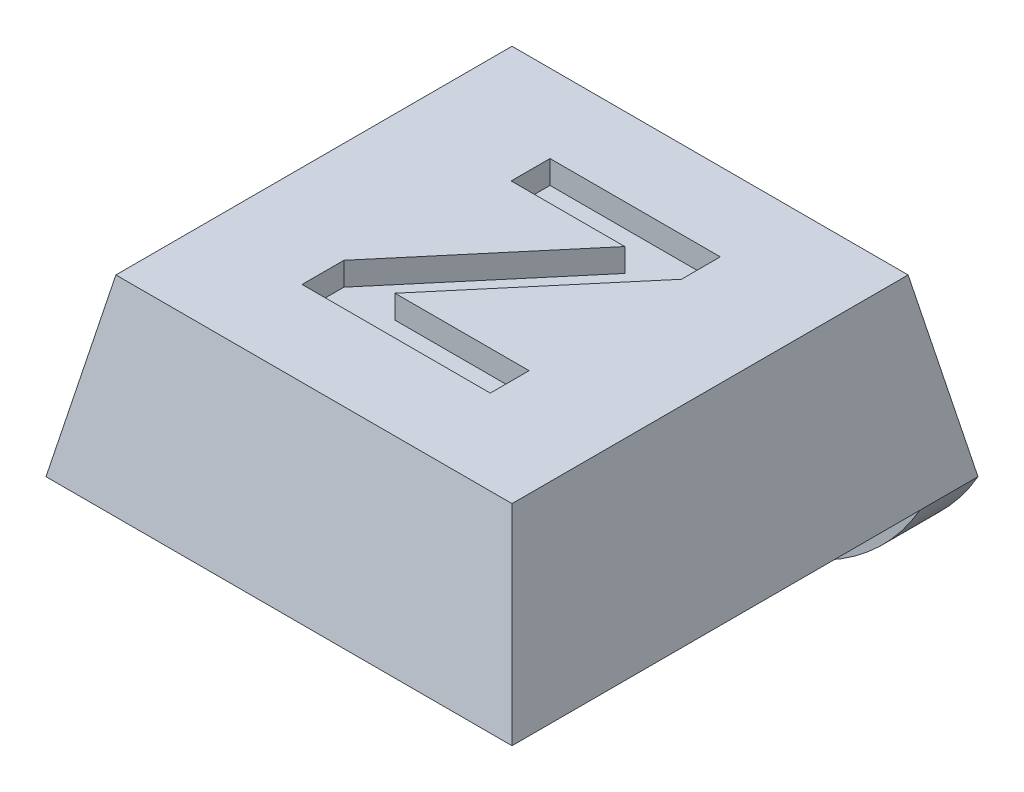
ISO-10303-21;
HEADER;
FILE_DESCRIPTION(('STEP AP214'),'2;1');
FILE_NAME('part.step','',(''),(''),'','','');
FILE_SCHEMA(('AUTOMOTIVE_DESIGN { 1 0 10303 214 1 1 1 1 }'));
ENDSEC;
DATA;
#1=APPLICATION_CONTEXT('core data for automotive mechanical design processes');
#2=APPLICATION_PROTOCOL_DEFINITION('international standard','automotive_design',2000,#1);
#3=PRODUCT_CONTEXT('',#1,'mechanical');
#4=PRODUCT('Part','Part','',(#3));
#5=PRODUCT_RELATED_PRODUCT_CATEGORY('part','',(#4));
#6=PRODUCT_DEFINITION_FORMATION('','',#4);
#7=PRODUCT_DEFINITION_CONTEXT('part definition',#1,'design');
#8=PRODUCT_DEFINITION('design','',#6,#7);
#9=PRODUCT_DEFINITION_SHAPE('','',#8);
#10=(LENGTH_UNIT() NAMED_UNIT(*) SI_UNIT(.MILLI.,.METRE.));
#11=(NAMED_UNIT(*) PLANE_ANGLE_UNIT() SI_UNIT($,.RADIAN.));
#12=(NAMED_UNIT(*) SI_UNIT($,.STERADIAN.) SOLID_ANGLE_UNIT());
#13=UNCERTAINTY_MEASURE_WITH_UNIT(LENGTH_MEASURE(1.E-05),#10,'distance_accuracy_value','');
#14=(GEOMETRIC_REPRESENTATION_CONTEXT(3) GLOBAL_UNCERTAINTY_ASSIGNED_CONTEXT((#13)) GLOBAL_UNIT_ASSIGNED_CONTEXT((#10,
#11,#12)) REPRESENTATION_CONTEXT('',''));
#15=CARTESIAN_POINT('',(0.,0.,0.));
#16=DIRECTION('',(0.,0.,1.));
#17=DIRECTION('',(1.,0.,0.));
#18=AXIS2_PLACEMENT_3D('',#15,#16,#17);
#19=CARTESIAN_POINT('',(0.,3.,0.));
#20=DIRECTION('',(0.,-1.,0.));
#21=DIRECTION('',(0.,0.,-1.));
#22=AXIS2_PLACEMENT_3D('',#19,#20,#21);
#23=PLANE('',#22);
#24=DIRECTION('',(-1.,0.,0.));
#25=VECTOR('',#24,1.);
#26=CARTESIAN_POINT('',(11.,3.,-0.6));
#27=LINE('',#26,#25);
#28=CARTESIAN_POINT('',(7.4,3.,-0.6));
#29=VERTEX_POINT('',#28);
#30=CARTESIAN_POINT('',(0.6,3.,-0.6));
#31=VERTEX_POINT('',#30);
#32=EDGE_CURVE('E217',#29,#31,#27,.T.);
#33=ORIENTED_EDGE('',*,*,#32,.F.);
#34=DIRECTION('',(0.,0.,1.));
#35=VECTOR('',#34,1.);
#36=CARTESIAN_POINT('',(7.4,3.,-8.));
#37=LINE('',#36,#35);
#38=CARTESIAN_POINT('',(7.4,3.,-7.4));
#39=VERTEX_POINT('',#38);
#40=EDGE_CURVE('E230',#39,#29,#37,.T.);
#41=ORIENTED_EDGE('',*,*,#40,.F.);
#42=DIRECTION('',(-1.,0.,0.));
#43=VECTOR('',#42,1.);
#44=CARTESIAN_POINT('',(11.,3.,-7.4));
#45=LINE('',#44,#43);
#46=CARTESIAN_POINT('',(0.599999999999999,3.,-7.4));
#47=VERTEX_POINT('',#46);
#48=EDGE_CURVE('E213',#39,#47,#45,.T.);
#49=ORIENTED_EDGE('',*,*,#48,.T.);
#50=DIRECTION('',(0.,0.,1.));
#51=VECTOR('',#50,1.);
#52=CARTESIAN_POINT('',(0.6,3.,-8.));
#53=LINE('',#52,#51);
#54=EDGE_CURVE('E233',#47,#31,#53,.T.);
#55=ORIENTED_EDGE('',*,*,#54,.T.);
#56=EDGE_LOOP('',(#33,#41,#49,#55));
#57=FACE_BOUND('',#56,.T.);
#58=DIRECTION('',(-1.,0.,0.));
#59=VECTOR('',#58,1.);
#60=CARTESIAN_POINT('',(5.57023744052671,3.,-2.05683246367483));
#61=LINE('',#60,#59);
#62=CARTESIAN_POINT('',(5.57023744052671,3.,-2.05683246367483));
#63=VERTEX_POINT('',#62);
#64=CARTESIAN_POINT('',(2.33946820975748,3.,-2.05683246367483));
#65=VERTEX_POINT('',#64);
#66=EDGE_CURVE('E58',#63,#65,#61,.T.);
#67=ORIENTED_EDGE('',*,*,#66,.T.);
#68=DIRECTION('',(0.,0.,-1.));
#69=VECTOR('',#68,1.);
#70=CARTESIAN_POINT('',(2.33946820975748,3.,-2.05683246367483));
#71=LINE('',#70,#69);
#72=CARTESIAN_POINT('',(2.33946820975748,3.,-2.77478118162354));
#73=VERTEX_POINT('',#72);
#74=EDGE_CURVE('E185',#65,#73,#71,.T.);
#75=ORIENTED_EDGE('',*,*,#74,.T.);
#76=DIRECTION('',(0.644870939209783,0.,-0.764291483507891));
#77=VECTOR('',#76,1.);
#78=CARTESIAN_POINT('',(2.33946820975748,3.,-2.77478118162354));
#79=LINE('',#78,#77);
#80=CARTESIAN_POINT('',(4.54619897898825,3.,-5.39016579700816));
#81=VERTEX_POINT('',#80);
#82=EDGE_CURVE('E624',#73,#81,#79,.T.);
#83=ORIENTED_EDGE('',*,*,#82,.T.);
#84=DIRECTION('',(-1.,0.,0.));
#85=VECTOR('',#84,1.);
#86=CARTESIAN_POINT('',(4.54619897898825,3.,-5.39016579700816));
#87=LINE('',#86,#85);
#88=CARTESIAN_POINT('',(2.59587846616773,3.,-5.39016579700816));
#89=VERTEX_POINT('',#88);
#90=EDGE_CURVE('E626',#81,#89,#87,.T.);
#91=ORIENTED_EDGE('',*,*,#90,.T.);
#92=DIRECTION('',(0.,0.,-1.));
#93=VECTOR('',#92,1.);
#94=CARTESIAN_POINT('',(2.59587846616773,3.,-5.39016579700816));
#95=LINE('',#94,#93);
#96=CARTESIAN_POINT('',(2.59587846616773,3.,-6.05683246367483));
#97=VERTEX_POINT('',#96);
#98=EDGE_CURVE('E631',#89,#97,#95,.T.);
#99=ORIENTED_EDGE('',*,*,#98,.T.);
#100=DIRECTION('',(1.,0.,0.));
#101=VECTOR('',#100,1.);
#102=CARTESIAN_POINT('',(2.59587846616773,3.,-6.05683246367483));
#103=LINE('',#102,#101);
#104=CARTESIAN_POINT('',(5.51895538924466,3.,-6.05683246367483));
#105=VERTEX_POINT('',#104);
#106=EDGE_CURVE('E641',#97,#105,#103,.T.);
#107=ORIENTED_EDGE('',*,*,#106,.T.);
#108=DIRECTION('',(0.,0.,1.));
#109=VECTOR('',#108,1.);
#110=CARTESIAN_POINT('',(5.51895538924466,3.,-6.05683246367483));
#111=LINE('',#110,#109);
#112=CARTESIAN_POINT('',(5.51895538924466,3.,-5.39016579700816));
#113=VERTEX_POINT('',#112);
#114=EDGE_CURVE('E596',#105,#113,#111,.T.);
#115=ORIENTED_EDGE('',*,*,#114,.T.);
#116=DIRECTION('',(-0.645005060359543,0.,0.76417829863886));
#117=VECTOR('',#116,1.);
#118=CARTESIAN_POINT('',(5.51895538924466,3.,-5.39016579700816));
#119=LINE('',#118,#117);
#120=CARTESIAN_POINT('',(3.26815410719337,3.,-2.72349913034149));
#121=VERTEX_POINT('',#120);
#122=EDGE_CURVE('E591',#113,#121,#119,.T.);
#123=ORIENTED_EDGE('',*,*,#122,.T.);
#124=DIRECTION('',(1.,0.,0.));
#125=VECTOR('',#124,1.);
#126=CARTESIAN_POINT('',(3.26815410719337,3.,-2.72349913034149));
#127=LINE('',#126,#125);
#128=CARTESIAN_POINT('',(5.57023744052671,3.,-2.72349913034149));
#129=VERTEX_POINT('',#128);
#130=EDGE_CURVE('E585',#121,#129,#127,.T.);
#131=ORIENTED_EDGE('',*,*,#130,.T.);
#132=DIRECTION('',(0.,0.,1.));
#133=VECTOR('',#132,1.);
#134=CARTESIAN_POINT('',(5.57023744052671,3.,-2.72349913034149));
#135=LINE('',#134,#133);
#136=EDGE_CURVE('E181',#129,#63,#135,.T.);
#137=ORIENTED_EDGE('',*,*,#136,.T.);
#138=EDGE_LOOP('',(#67,#75,#83,#91,#99,#107,#115,#123,#131,#137));
#139=FACE_BOUND('',#138,.T.);
#140=ADVANCED_FACE('F42',(#57,#139),#23,.F.);
#141=CARTESIAN_POINT('',(8.,0.,-8.));
#142=DIRECTION('',(-0.98058067569092,-0.196116135138184,0.));
#143=DIRECTION('',(0.196116135138184,-0.98058067569092,0.));
#144=AXIS2_PLACEMENT_3D('',#141,#142,#143);
#145=PLANE('',#144);
#146=DIRECTION('',(-0.192450089729875,0.962250448649376,-0.192450089729875));
#147=VECTOR('',#146,1.);
#148=CARTESIAN_POINT('',(7.7037037037037,1.48148148148148,-0.296296296296296));
#149=LINE('',#148,#147);
#150=CARTESIAN_POINT('',(8.,0.,0.));
#151=VERTEX_POINT('',#150);
#152=EDGE_CURVE('E227',#151,#29,#149,.T.);
#153=ORIENTED_EDGE('',*,*,#152,.F.);
#154=DIRECTION('',(0.,0.,-1.));
#155=VECTOR('',#154,1.);
#156=CARTESIAN_POINT('',(8.,0.,0.));
#157=LINE('',#156,#155);
#158=CARTESIAN_POINT('',(8.,0.,-7.));
#159=VERTEX_POINT('',#158);
#160=EDGE_CURVE('E246',#151,#159,#157,.T.);
#161=ORIENTED_EDGE('',*,*,#160,.T.);
#162=DIRECTION('',(0.,0.,1.));
#163=VECTOR('',#162,1.);
#164=CARTESIAN_POINT('',(8.,0.,-8.));
#165=LINE('',#164,#163);
#166=CARTESIAN_POINT('',(8.,0.,-8.));
#167=VERTEX_POINT('',#166);
#168=EDGE_CURVE('E187',#167,#159,#165,.T.);
#169=ORIENTED_EDGE('',*,*,#168,.F.);
#170=DIRECTION('',(0.192450089729875,-0.962250448649376,-0.192450089729875));
#171=VECTOR('',#170,1.);
#172=CARTESIAN_POINT('',(8.,0.,-8.));
#173=LINE('',#172,#171);
#174=EDGE_CURVE('E220',#39,#167,#173,.T.);
#175=ORIENTED_EDGE('',*,*,#174,.F.);
#176=ORIENTED_EDGE('',*,*,#40,.T.);
#177=EDGE_LOOP('',(#153,#161,#169,#175,#176));
#178=FACE_BOUND('',#177,.T.);
#179=ADVANCED_FACE('F314',(#178),#145,.F.);
#180=CARTESIAN_POINT('',(0.,0.,-8.));
#181=DIRECTION('',(0.98058067569092,-0.196116135138184,0.));
#182=DIRECTION('',(0.196116135138184,0.98058067569092,0.));
#183=AXIS2_PLACEMENT_3D('',#180,#181,#182);
#184=PLANE('',#183);
#185=DIRECTION('',(-0.192450089729875,-0.962250448649376,0.192450089729875));
#186=VECTOR('',#185,1.);
#187=CARTESIAN_POINT('',(0.296296296296296,1.48148148148148,-0.296296296296296));
#188=LINE('',#187,#186);
#189=CARTESIAN_POINT('',(0.,0.,0.));
#190=VERTEX_POINT('',#189);
#191=EDGE_CURVE('E274',#31,#190,#188,.T.);
#192=ORIENTED_EDGE('',*,*,#191,.F.);
#193=ORIENTED_EDGE('',*,*,#54,.F.);
#194=DIRECTION('',(0.192450089729875,0.962250448649376,0.192450089729875));
#195=VECTOR('',#194,1.);
#196=CARTESIAN_POINT('',(0.,0.,-8.));
#197=LINE('',#196,#195);
#198=CARTESIAN_POINT('',(0.,0.,-8.));
#199=VERTEX_POINT('',#198);
#200=EDGE_CURVE('E245',#199,#47,#197,.T.);
#201=ORIENTED_EDGE('',*,*,#200,.F.);
#202=DIRECTION('',(0.,0.,1.));
#203=VECTOR('',#202,1.);
#204=CARTESIAN_POINT('',(0.,0.,0.));
#205=LINE('',#204,#203);
#206=CARTESIAN_POINT('',(0.,0.,-7.));
#207=VERTEX_POINT('',#206);
#208=EDGE_CURVE('E250',#199,#207,#205,.T.);
#209=ORIENTED_EDGE('',*,*,#208,.T.);
#210=EDGE_CURVE('E237',#207,#190,#205,.T.);
#211=ORIENTED_EDGE('',*,*,#210,.T.);
#212=EDGE_LOOP('',(#192,#193,#201,#209,#211));
#213=FACE_BOUND('',#212,.T.);
#214=ADVANCED_FACE('F298',(#213),#184,.F.);
#215=CARTESIAN_POINT('',(0.,0.,0.));
#216=DIRECTION('',(0.,-1.,0.));
#217=DIRECTION('',(0.,0.,-1.));
#218=AXIS2_PLACEMENT_3D('',#215,#216,#217);
#219=PLANE('',#218);
#220=DIRECTION('',(-1.,0.,0.));
#221=VECTOR('',#220,1.);
#222=CARTESIAN_POINT('',(0.,0.,-7.));
#223=LINE('',#222,#221);
#224=EDGE_CURVE('E193',#159,#207,#223,.T.);
#225=ORIENTED_EDGE('',*,*,#224,.F.);
#226=ORIENTED_EDGE('',*,*,#160,.F.);
#227=DIRECTION('',(1.,0.,0.));
#228=VECTOR('',#227,1.);
#229=CARTESIAN_POINT('',(0.,0.,0.));
#230=LINE('',#229,#228);
#231=EDGE_CURVE('E247',#190,#151,#230,.T.);
#232=ORIENTED_EDGE('',*,*,#231,.F.);
#233=ORIENTED_EDGE('',*,*,#210,.F.);
#234=EDGE_LOOP('',(#225,#226,#232,#233));
#235=FACE_BOUND('',#234,.T.);
#236=CARTESIAN_POINT('',(4.,0.,-3.75));
#237=DIRECTION('',(0.,-1.,0.));
#238=DIRECTION('',(0.,0.,-1.));
#239=AXIS2_PLACEMENT_3D('',#236,#237,#238);
#240=CIRCLE('',#239,1.8);
#241=CARTESIAN_POINT('',(4.,0.,-5.55));
#242=VERTEX_POINT('',#241);
#243=EDGE_CURVE('E205',#242,#242,#240,.T.);
#244=ORIENTED_EDGE('',*,*,#243,.F.);
#245=EDGE_LOOP('',(#244));
#246=FACE_BOUND('',#245,.T.);
#247=ADVANCED_FACE('F309',(#235,#246),#219,.T.);
#248=CARTESIAN_POINT('',(11.,3.,-7.4));
#249=DIRECTION('',(0.,0.196116135138184,-0.98058067569092));
#250=DIRECTION('',(0.,0.98058067569092,0.196116135138184));
#251=AXIS2_PLACEMENT_3D('',#248,#249,#250);
#252=PLANE('',#251);
#253=ORIENTED_EDGE('',*,*,#174,.T.);
#254=DIRECTION('',(-1.,0.,0.));
#255=VECTOR('',#254,1.);
#256=CARTESIAN_POINT('',(0.,0.,-8.));
#257=LINE('',#256,#255);
#258=EDGE_CURVE('E241',#167,#199,#257,.T.);
#259=ORIENTED_EDGE('',*,*,#258,.T.);
#260=ORIENTED_EDGE('',*,*,#200,.T.);
#261=ORIENTED_EDGE('',*,*,#48,.F.);
#262=EDGE_LOOP('',(#253,#259,#260,#261));
#263=FACE_BOUND('',#262,.T.);
#264=ADVANCED_FACE('F293',(#263),#252,.T.);
#265=CARTESIAN_POINT('',(11.,0.,0.));
#266=DIRECTION('',(0.,0.196116135138184,0.98058067569092));
#267=DIRECTION('',(0.,-0.98058067569092,0.196116135138184));
#268=AXIS2_PLACEMENT_3D('',#265,#266,#267);
#269=PLANE('',#268);
#270=ORIENTED_EDGE('',*,*,#152,.T.);
#271=ORIENTED_EDGE('',*,*,#32,.T.);
#272=ORIENTED_EDGE('',*,*,#191,.T.);
#273=ORIENTED_EDGE('',*,*,#231,.T.);
#274=EDGE_LOOP('',(#270,#271,#272,#273));
#275=FACE_BOUND('',#274,.T.);
#276=ADVANCED_FACE('F340',(#275),#269,.T.);
#277=CARTESIAN_POINT('',(4.,0.8,-3.75));
#278=DIRECTION('',(0.,-1.,0.));
#279=DIRECTION('',(0.,0.,-1.));
#280=AXIS2_PLACEMENT_3D('',#277,#278,#279);
#281=CYLINDRICAL_SURFACE('',#280,1.8);
#282=CARTESIAN_POINT('',(4.,0.8,-3.75));
#283=DIRECTION('',(0.,-1.,0.));
#284=DIRECTION('',(0.,0.,-1.));
#285=AXIS2_PLACEMENT_3D('',#282,#283,#284);
#286=CIRCLE('',#285,1.8);
#287=CARTESIAN_POINT('',(4.,0.8,-5.55));
#288=VERTEX_POINT('',#287);
#289=EDGE_CURVE('E209',#288,#288,#286,.T.);
#290=ORIENTED_EDGE('',*,*,#289,.F.);
#291=EDGE_LOOP('',(#290));
#292=FACE_BOUND('',#291,.T.);
#293=ORIENTED_EDGE('',*,*,#243,.T.);
#294=EDGE_LOOP('',(#293));
#295=FACE_BOUND('',#294,.T.);
#296=ADVANCED_FACE('F347',(#292,#295),#281,.F.);
#297=CARTESIAN_POINT('',(4.,0.8,-3.75));
#298=DIRECTION('',(0.,-1.,0.));
#299=DIRECTION('',(0.,0.,-1.));
#300=AXIS2_PLACEMENT_3D('',#297,#298,#299);
#301=PLANE('',#300);
#302=ORIENTED_EDGE('',*,*,#289,.T.);
#303=EDGE_LOOP('',(#302));
#304=FACE_BOUND('',#303,.T.);
#305=ADVANCED_FACE('F351',(#304),#301,.T.);
#306=CARTESIAN_POINT('',(0.,-2.,-8.));
#307=DIRECTION('',(0.,0.,1.));
#308=DIRECTION('',(1.,0.,0.));
#309=AXIS2_PLACEMENT_3D('',#306,#307,#308);
#310=PLANE('',#309);
#311=ORIENTED_EDGE('',*,*,#258,.F.);
#312=CARTESIAN_POINT('',(4.53589838486225,2.,-8.));
#313=DIRECTION('',(0.,0.,1.));
#314=DIRECTION('',(1.,0.,0.));
#315=AXIS2_PLACEMENT_3D('',#312,#313,#314);
#316=CIRCLE('',#315,4.);
#317=CARTESIAN_POINT('',(4.53589838486225,-2.,-8.));
#318=VERTEX_POINT('',#317);
#319=EDGE_CURVE('E11',#167,#318,#316,.F.);
#320=ORIENTED_EDGE('',*,*,#319,.T.);
#321=DIRECTION('',(1.,0.,0.));
#322=VECTOR('',#321,1.);
#323=CARTESIAN_POINT('',(0.,-2.,-8.));
#324=LINE('',#323,#322);
#325=CARTESIAN_POINT('',(3.46410161513775,-2.,-8.));
#326=VERTEX_POINT('',#325);
#327=EDGE_CURVE('E199',#326,#318,#324,.T.);
#328=ORIENTED_EDGE('',*,*,#327,.F.);
#329=CARTESIAN_POINT('',(3.46410161513775,2.,-8.));
#330=DIRECTION('',(0.,0.,1.));
#331=DIRECTION('',(1.,0.,0.));
#332=AXIS2_PLACEMENT_3D('',#329,#330,#331);
#333=CIRCLE('',#332,4.);
#334=EDGE_CURVE('E51',#326,#199,#333,.F.);
#335=ORIENTED_EDGE('',*,*,#334,.T.);
#336=EDGE_LOOP('',(#311,#320,#328,#335));
#337=FACE_BOUND('',#336,.T.);
#338=ADVANCED_FACE('F286',(#337),#310,.F.);
#339=CARTESIAN_POINT('',(0.,-2.,-7.));
#340=DIRECTION('',(0.,0.,-1.));
#341=DIRECTION('',(-1.,0.,0.));
#342=AXIS2_PLACEMENT_3D('',#339,#340,#341);
#343=PLANE('',#342);
#344=DIRECTION('',(-1.,0.,0.));
#345=VECTOR('',#344,1.);
#346=CARTESIAN_POINT('',(0.,-2.,-7.));
#347=LINE('',#346,#345);
#348=CARTESIAN_POINT('',(4.53589838486225,-2.,-7.));
#349=VERTEX_POINT('',#348);
#350=CARTESIAN_POINT('',(3.46410161513775,-2.,-7.));
#351=VERTEX_POINT('',#350);
#352=EDGE_CURVE('E203',#349,#351,#347,.T.);
#353=ORIENTED_EDGE('',*,*,#352,.F.);
#354=CARTESIAN_POINT('',(4.53589838486225,2.,-7.));
#355=DIRECTION('',(0.,0.,-1.));
#356=DIRECTION('',(-1.,0.,0.));
#357=AXIS2_PLACEMENT_3D('',#354,#355,#356);
#358=CIRCLE('',#357,4.);
#359=EDGE_CURVE('E280',#349,#159,#358,.F.);
#360=ORIENTED_EDGE('',*,*,#359,.T.);
#361=ORIENTED_EDGE('',*,*,#224,.T.);
#362=CARTESIAN_POINT('',(3.46410161513775,2.,-7.));
#363=DIRECTION('',(0.,0.,-1.));
#364=DIRECTION('',(-1.,0.,0.));
#365=AXIS2_PLACEMENT_3D('',#362,#363,#364);
#366=CIRCLE('',#365,4.);
#367=EDGE_CURVE('E66',#207,#351,#366,.F.);
#368=ORIENTED_EDGE('',*,*,#367,.T.);
#369=EDGE_LOOP('',(#353,#360,#361,#368));
#370=FACE_BOUND('',#369,.T.);
#371=ADVANCED_FACE('F304',(#370),#343,.F.);
#372=CARTESIAN_POINT('',(0.,-2.,0.));
#373=DIRECTION('',(0.,1.,0.));
#374=DIRECTION('',(0.,0.,1.));
#375=AXIS2_PLACEMENT_3D('',#372,#373,#374);
#376=PLANE('',#375);
#377=ORIENTED_EDGE('',*,*,#327,.T.);
#378=DIRECTION('',(0.,0.,1.));
#379=VECTOR('',#378,1.);
#380=CARTESIAN_POINT('',(4.53589838486225,-2.,0.));
#381=LINE('',#380,#379);
#382=EDGE_CURVE('E273',#318,#349,#381,.T.);
#383=ORIENTED_EDGE('',*,*,#382,.T.);
#384=ORIENTED_EDGE('',*,*,#352,.T.);
#385=DIRECTION('',(0.,0.,-1.));
#386=VECTOR('',#385,1.);
#387=CARTESIAN_POINT('',(3.46410161513775,-2.,0.));
#388=LINE('',#387,#386);
#389=EDGE_CURVE('E269',#351,#326,#388,.T.);
#390=ORIENTED_EDGE('',*,*,#389,.T.);
#391=EDGE_LOOP('',(#377,#383,#384,#390));
#392=FACE_BOUND('',#391,.T.);
#393=ADVANCED_FACE('F302',(#392),#376,.F.);
#394=CARTESIAN_POINT('',(4.53589838486225,2.,-8.));
#395=DIRECTION('',(0.,0.,1.));
#396=DIRECTION('',(1.,0.,0.));
#397=AXIS2_PLACEMENT_3D('',#394,#395,#396);
#398=CYLINDRICAL_SURFACE('',#397,4.);
#399=ORIENTED_EDGE('',*,*,#319,.F.);
#400=ORIENTED_EDGE('',*,*,#168,.T.);
#401=ORIENTED_EDGE('',*,*,#359,.F.);
#402=ORIENTED_EDGE('',*,*,#382,.F.);
#403=EDGE_LOOP('',(#399,#400,#401,#402));
#404=FACE_BOUND('',#403,.T.);
#405=ADVANCED_FACE('F315',(#404),#398,.T.);
#406=CARTESIAN_POINT('',(3.46410161513775,2.,-8.));
#407=DIRECTION('',(0.,0.,-1.));
#408=DIRECTION('',(-1.,0.,0.));
#409=AXIS2_PLACEMENT_3D('',#406,#407,#408);
#410=CYLINDRICAL_SURFACE('',#409,4.);
#411=ORIENTED_EDGE('',*,*,#367,.F.);
#412=ORIENTED_EDGE('',*,*,#208,.F.);
#413=ORIENTED_EDGE('',*,*,#334,.F.);
#414=ORIENTED_EDGE('',*,*,#389,.F.);
#415=EDGE_LOOP('',(#411,#412,#413,#414));
#416=FACE_BOUND('',#415,.T.);
#417=ADVANCED_FACE('F44',(#416),#410,.T.);
#418=CARTESIAN_POINT('',(5.57023744052671,2.6,-2.05683246367483));
#419=DIRECTION('',(0.,0.,-1.));
#420=DIRECTION('',(-1.,0.,0.));
#421=AXIS2_PLACEMENT_3D('',#418,#419,#420);
#422=PLANE('',#421);
#423=ORIENTED_EDGE('',*,*,#66,.F.);
#424=DIRECTION('',(0.,1.,0.));
#425=VECTOR('',#424,1.);
#426=CARTESIAN_POINT('',(5.57023744052671,2.6,-2.05683246367483));
#427=LINE('',#426,#425);
#428=CARTESIAN_POINT('',(5.57023744052671,2.6,-2.05683246367483));
#429=VERTEX_POINT('',#428);
#430=EDGE_CURVE('E179',#429,#63,#427,.T.);
#431=ORIENTED_EDGE('',*,*,#430,.F.);
#432=DIRECTION('',(-1.,0.,0.));
#433=VECTOR('',#432,1.);
#434=CARTESIAN_POINT('',(5.57023744052671,2.6,-2.05683246367483));
#435=LINE('',#434,#433);
#436=CARTESIAN_POINT('',(2.33946820975748,2.6,-2.05683246367483));
#437=VERTEX_POINT('',#436);
#438=EDGE_CURVE('E169',#429,#437,#435,.T.);
#439=ORIENTED_EDGE('',*,*,#438,.T.);
#440=DIRECTION('',(0.,1.,0.));
#441=VECTOR('',#440,1.);
#442=CARTESIAN_POINT('',(2.33946820975748,2.6,-2.05683246367483));
#443=LINE('',#442,#441);
#444=EDGE_CURVE('E178',#437,#65,#443,.T.);
#445=ORIENTED_EDGE('',*,*,#444,.T.);
#446=EDGE_LOOP('',(#423,#431,#439,#445));
#447=FACE_BOUND('',#446,.T.);
#448=ADVANCED_FACE('F177',(#447),#422,.T.);
#449=CARTESIAN_POINT('',(2.33946820975748,2.6,-2.05683246367483));
#450=DIRECTION('',(1.,0.,0.));
#451=DIRECTION('',(0.,0.,-1.));
#452=AXIS2_PLACEMENT_3D('',#449,#450,#451);
#453=PLANE('',#452);
#454=ORIENTED_EDGE('',*,*,#74,.F.);
#455=ORIENTED_EDGE('',*,*,#444,.F.);
#456=DIRECTION('',(0.,0.,-1.));
#457=VECTOR('',#456,1.);
#458=CARTESIAN_POINT('',(2.33946820975748,2.6,-2.05683246367483));
#459=LINE('',#458,#457);
#460=CARTESIAN_POINT('',(2.33946820975748,2.6,-2.77478118162354));
#461=VERTEX_POINT('',#460);
#462=EDGE_CURVE('E165',#437,#461,#459,.T.);
#463=ORIENTED_EDGE('',*,*,#462,.T.);
#464=DIRECTION('',(0.,1.,0.));
#465=VECTOR('',#464,1.);
#466=CARTESIAN_POINT('',(2.33946820975748,2.6,-2.77478118162354));
#467=LINE('',#466,#465);
#468=EDGE_CURVE('E188',#461,#73,#467,.T.);
#469=ORIENTED_EDGE('',*,*,#468,.T.);
#470=EDGE_LOOP('',(#454,#455,#463,#469));
#471=FACE_BOUND('',#470,.T.);
#472=ADVANCED_FACE('F183',(#471),#453,.T.);
#473=CARTESIAN_POINT('',(2.33946820975748,2.6,-2.77478118162354));
#474=DIRECTION('',(0.764291483507891,0.,0.644870939209783));
#475=DIRECTION('',(0.644870939209783,0.,-0.764291483507891));
#476=AXIS2_PLACEMENT_3D('',#473,#474,#475);
#477=PLANE('',#476);
#478=ORIENTED_EDGE('',*,*,#82,.F.);
#479=ORIENTED_EDGE('',*,*,#468,.F.);
#480=DIRECTION('',(0.644870939209783,0.,-0.764291483507891));
#481=VECTOR('',#480,1.);
#482=CARTESIAN_POINT('',(2.33946820975748,2.6,-2.77478118162354));
#483=LINE('',#482,#481);
#484=CARTESIAN_POINT('',(4.54619897898825,2.6,-5.39016579700816));
#485=VERTEX_POINT('',#484);
#486=EDGE_CURVE('E171',#461,#485,#483,.T.);
#487=ORIENTED_EDGE('',*,*,#486,.T.);
#488=DIRECTION('',(0.,1.,0.));
#489=VECTOR('',#488,1.);
#490=CARTESIAN_POINT('',(4.54619897898825,2.6,-5.39016579700816));
#491=LINE('',#490,#489);
#492=EDGE_CURVE('E195',#485,#81,#491,.T.);
#493=ORIENTED_EDGE('',*,*,#492,.T.);
#494=EDGE_LOOP('',(#478,#479,#487,#493));
#495=FACE_BOUND('',#494,.T.);
#496=ADVANCED_FACE('F364',(#495),#477,.T.);
#497=CARTESIAN_POINT('',(4.54619897898825,2.6,-5.39016579700816));
#498=DIRECTION('',(0.,0.,-1.));
#499=DIRECTION('',(-1.,0.,0.));
#500=AXIS2_PLACEMENT_3D('',#497,#498,#499);
#501=PLANE('',#500);
#502=ORIENTED_EDGE('',*,*,#90,.F.);
#503=ORIENTED_EDGE('',*,*,#492,.F.);
#504=DIRECTION('',(-1.,0.,0.));
#505=VECTOR('',#504,1.);
#506=CARTESIAN_POINT('',(4.54619897898825,2.6,-5.39016579700816));
#507=LINE('',#506,#505);
#508=CARTESIAN_POINT('',(2.59587846616773,2.6,-5.39016579700816));
#509=VERTEX_POINT('',#508);
#510=EDGE_CURVE('E671',#485,#509,#507,.T.);
#511=ORIENTED_EDGE('',*,*,#510,.T.);
#512=DIRECTION('',(0.,1.,0.));
#513=VECTOR('',#512,1.);
#514=CARTESIAN_POINT('',(2.59587846616773,2.6,-5.39016579700816));
#515=LINE('',#514,#513);
#516=EDGE_CURVE('E617',#509,#89,#515,.T.);
#517=ORIENTED_EDGE('',*,*,#516,.T.);
#518=EDGE_LOOP('',(#502,#503,#511,#517));
#519=FACE_BOUND('',#518,.T.);
#520=ADVANCED_FACE('F367',(#519),#501,.T.);
#521=CARTESIAN_POINT('',(2.59587846616773,2.6,-5.39016579700816));
#522=DIRECTION('',(1.,0.,0.));
#523=DIRECTION('',(0.,0.,-1.));
#524=AXIS2_PLACEMENT_3D('',#521,#522,#523);
#525=PLANE('',#524);
#526=ORIENTED_EDGE('',*,*,#98,.F.);
#527=ORIENTED_EDGE('',*,*,#516,.F.);
#528=DIRECTION('',(0.,0.,-1.));
#529=VECTOR('',#528,1.);
#530=CARTESIAN_POINT('',(2.59587846616773,2.6,-5.39016579700816));
#531=LINE('',#530,#529);
#532=CARTESIAN_POINT('',(2.59587846616773,2.6,-6.05683246367483));
#533=VERTEX_POINT('',#532);
#534=EDGE_CURVE('E668',#509,#533,#531,.T.);
#535=ORIENTED_EDGE('',*,*,#534,.T.);
#536=DIRECTION('',(0.,1.,0.));
#537=VECTOR('',#536,1.);
#538=CARTESIAN_POINT('',(2.59587846616773,2.6,-6.05683246367483));
#539=LINE('',#538,#537);
#540=EDGE_CURVE('E614',#533,#97,#539,.T.);
#541=ORIENTED_EDGE('',*,*,#540,.T.);
#542=EDGE_LOOP('',(#526,#527,#535,#541));
#543=FACE_BOUND('',#542,.T.);
#544=ADVANCED_FACE('F371',(#543),#525,.T.);
#545=CARTESIAN_POINT('',(2.59587846616773,2.6,-6.05683246367483));
#546=DIRECTION('',(0.,0.,1.));
#547=DIRECTION('',(1.,0.,0.));
#548=AXIS2_PLACEMENT_3D('',#545,#546,#547);
#549=PLANE('',#548);
#550=ORIENTED_EDGE('',*,*,#106,.F.);
#551=ORIENTED_EDGE('',*,*,#540,.F.);
#552=DIRECTION('',(1.,0.,0.));
#553=VECTOR('',#552,1.);
#554=CARTESIAN_POINT('',(2.59587846616773,2.6,-6.05683246367483));
#555=LINE('',#554,#553);
#556=CARTESIAN_POINT('',(5.51895538924466,2.6,-6.05683246367483));
#557=VERTEX_POINT('',#556);
#558=EDGE_CURVE('E665',#533,#557,#555,.T.);
#559=ORIENTED_EDGE('',*,*,#558,.T.);
#560=DIRECTION('',(0.,1.,0.));
#561=VECTOR('',#560,1.);
#562=CARTESIAN_POINT('',(5.51895538924466,2.6,-6.05683246367483));
#563=LINE('',#562,#561);
#564=EDGE_CURVE('E611',#557,#105,#563,.T.);
#565=ORIENTED_EDGE('',*,*,#564,.T.);
#566=EDGE_LOOP('',(#550,#551,#559,#565));
#567=FACE_BOUND('',#566,.T.);
#568=ADVANCED_FACE('F375',(#567),#549,.T.);
#569=CARTESIAN_POINT('',(5.51895538924466,2.6,-6.05683246367483));
#570=DIRECTION('',(-1.,0.,0.));
#571=DIRECTION('',(0.,0.,1.));
#572=AXIS2_PLACEMENT_3D('',#569,#570,#571);
#573=PLANE('',#572);
#574=ORIENTED_EDGE('',*,*,#114,.F.);
#575=ORIENTED_EDGE('',*,*,#564,.F.);
#576=DIRECTION('',(0.,0.,1.));
#577=VECTOR('',#576,1.);
#578=CARTESIAN_POINT('',(5.51895538924466,2.6,-6.05683246367483));
#579=LINE('',#578,#577);
#580=CARTESIAN_POINT('',(5.51895538924466,2.6,-5.39016579700816));
#581=VERTEX_POINT('',#580);
#582=EDGE_CURVE('E650',#557,#581,#579,.T.);
#583=ORIENTED_EDGE('',*,*,#582,.T.);
#584=DIRECTION('',(0.,1.,0.));
#585=VECTOR('',#584,1.);
#586=CARTESIAN_POINT('',(5.51895538924466,2.6,-5.39016579700816));
#587=LINE('',#586,#585);
#588=EDGE_CURVE('E608',#581,#113,#587,.T.);
#589=ORIENTED_EDGE('',*,*,#588,.T.);
#590=EDGE_LOOP('',(#574,#575,#583,#589));
#591=FACE_BOUND('',#590,.T.);
#592=ADVANCED_FACE('F379',(#591),#573,.T.);
#593=CARTESIAN_POINT('',(5.51895538924466,2.6,-5.39016579700816));
#594=DIRECTION('',(-0.76417829863886,0.,-0.645005060359543));
#595=DIRECTION('',(-0.645005060359543,0.,0.76417829863886));
#596=AXIS2_PLACEMENT_3D('',#593,#594,#595);
#597=PLANE('',#596);
#598=ORIENTED_EDGE('',*,*,#122,.F.);
#599=ORIENTED_EDGE('',*,*,#588,.F.);
#600=DIRECTION('',(-0.645005060359543,0.,0.76417829863886));
#601=VECTOR('',#600,1.);
#602=CARTESIAN_POINT('',(5.51895538924466,2.6,-5.39016579700816));
#603=LINE('',#602,#601);
#604=CARTESIAN_POINT('',(3.26815410719337,2.6,-2.72349913034149));
#605=VERTEX_POINT('',#604);
#606=EDGE_CURVE('E652',#581,#605,#603,.T.);
#607=ORIENTED_EDGE('',*,*,#606,.T.);
#608=DIRECTION('',(0.,1.,0.));
#609=VECTOR('',#608,1.);
#610=CARTESIAN_POINT('',(3.26815410719337,2.6,-2.72349913034149));
#611=LINE('',#610,#609);
#612=EDGE_CURVE('E605',#605,#121,#611,.T.);
#613=ORIENTED_EDGE('',*,*,#612,.T.);
#614=EDGE_LOOP('',(#598,#599,#607,#613));
#615=FACE_BOUND('',#614,.T.);
#616=ADVANCED_FACE('F383',(#615),#597,.T.);
#617=CARTESIAN_POINT('',(3.26815410719337,2.6,-2.72349913034149));
#618=DIRECTION('',(0.,0.,1.));
#619=DIRECTION('',(1.,0.,0.));
#620=AXIS2_PLACEMENT_3D('',#617,#618,#619);
#621=PLANE('',#620);
#622=ORIENTED_EDGE('',*,*,#130,.F.);
#623=ORIENTED_EDGE('',*,*,#612,.F.);
#624=DIRECTION('',(1.,0.,0.));
#625=VECTOR('',#624,1.);
#626=CARTESIAN_POINT('',(3.26815410719337,2.6,-2.72349913034149));
#627=LINE('',#626,#625);
#628=CARTESIAN_POINT('',(5.57023744052671,2.6,-2.72349913034149));
#629=VERTEX_POINT('',#628);
#630=EDGE_CURVE('E654',#605,#629,#627,.T.);
#631=ORIENTED_EDGE('',*,*,#630,.T.);
#632=DIRECTION('',(0.,1.,0.));
#633=VECTOR('',#632,1.);
#634=CARTESIAN_POINT('',(5.57023744052671,2.6,-2.72349913034149));
#635=LINE('',#634,#633);
#636=EDGE_CURVE('E583',#629,#129,#635,.T.);
#637=ORIENTED_EDGE('',*,*,#636,.T.);
#638=EDGE_LOOP('',(#622,#623,#631,#637));
#639=FACE_BOUND('',#638,.T.);
#640=ADVANCED_FACE('F387',(#639),#621,.T.);
#641=CARTESIAN_POINT('',(5.57023744052671,2.6,-2.72349913034149));
#642=DIRECTION('',(-1.,0.,0.));
#643=DIRECTION('',(0.,0.,1.));
#644=AXIS2_PLACEMENT_3D('',#641,#642,#643);
#645=PLANE('',#644);
#646=ORIENTED_EDGE('',*,*,#136,.F.);
#647=ORIENTED_EDGE('',*,*,#636,.F.);
#648=DIRECTION('',(0.,0.,1.));
#649=VECTOR('',#648,1.);
#650=CARTESIAN_POINT('',(5.57023744052671,2.6,-2.72349913034149));
#651=LINE('',#650,#649);
#652=EDGE_CURVE('E602',#629,#429,#651,.T.);
#653=ORIENTED_EDGE('',*,*,#652,.T.);
#654=ORIENTED_EDGE('',*,*,#430,.T.);
#655=EDGE_LOOP('',(#646,#647,#653,#654));
#656=FACE_BOUND('',#655,.T.);
#657=ADVANCED_FACE('F391',(#656),#645,.T.);
#658=CARTESIAN_POINT('',(0.,2.6,0.));
#659=DIRECTION('',(0.,-1.,0.));
#660=DIRECTION('',(0.,0.,-1.));
#661=AXIS2_PLACEMENT_3D('',#658,#659,#660);
#662=PLANE('',#661);
#663=ORIENTED_EDGE('',*,*,#438,.F.);
#664=ORIENTED_EDGE('',*,*,#652,.F.);
#665=ORIENTED_EDGE('',*,*,#630,.F.);
#666=ORIENTED_EDGE('',*,*,#606,.F.);
#667=ORIENTED_EDGE('',*,*,#582,.F.);
#668=ORIENTED_EDGE('',*,*,#558,.F.);
#669=ORIENTED_EDGE('',*,*,#534,.F.);
#670=ORIENTED_EDGE('',*,*,#510,.F.);
#671=ORIENTED_EDGE('',*,*,#486,.F.);
#672=ORIENTED_EDGE('',*,*,#462,.F.);
#673=EDGE_LOOP('',(#663,#664,#665,#666,#667,#668,#669,#670,#671,#672));
#674=FACE_BOUND('',#673,.T.);
#675=ADVANCED_FACE('F167',(#674),#662,.F.);
#676=CLOSED_SHELL('',(#140,#179,#214,#247,#264,#276,#296,#305,#338,#371,#393,#405,#417,#448,
#472,#496,#520,#544,#568,#592,#616,#640,#657,#675));
#677=MANIFOLD_SOLID_BREP('B2',#676);
#678=ADVANCED_BREP_SHAPE_REPRESENTATION('',(#18,#677),#14);
#679=SHAPE_DEFINITION_REPRESENTATION(#9,#678);
ENDSEC;
END-ISO-10303-21;
